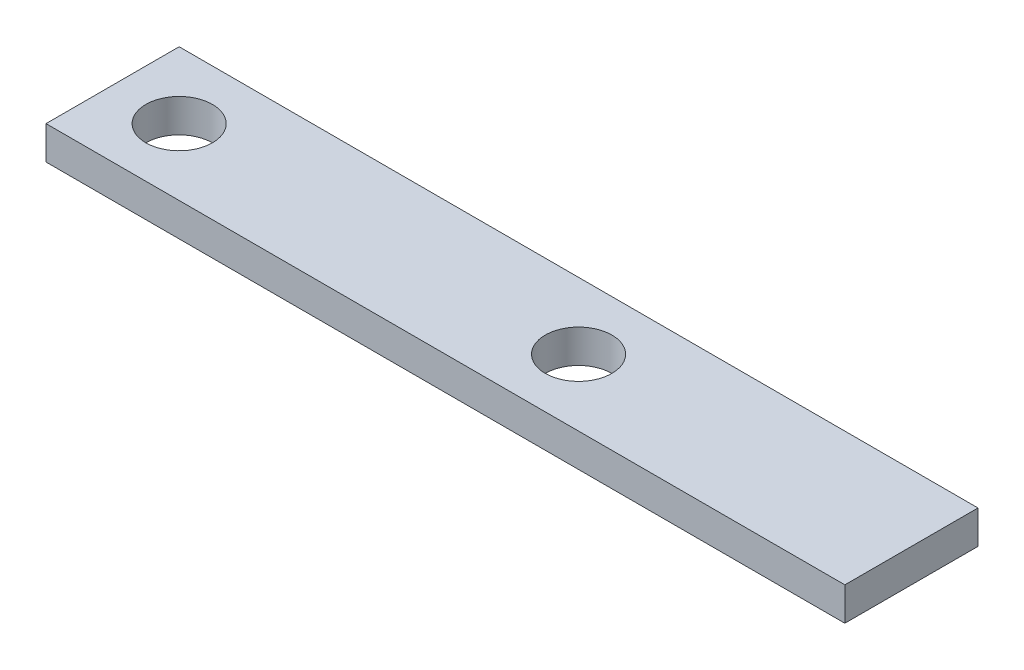
ISO-10303-21;
HEADER;
FILE_DESCRIPTION(('STEP AP214'),'2;1');
FILE_NAME('part.step','',(''),(''),'','','');
FILE_SCHEMA(('AUTOMOTIVE_DESIGN { 1 0 10303 214 1 1 1 1 }'));
ENDSEC;
DATA;
#1=APPLICATION_CONTEXT('core data for automotive mechanical design processes');
#2=APPLICATION_PROTOCOL_DEFINITION('international standard','automotive_design',2000,#1);
#3=PRODUCT_CONTEXT('',#1,'mechanical');
#4=PRODUCT('Part','Part','',(#3));
#5=PRODUCT_RELATED_PRODUCT_CATEGORY('part','',(#4));
#6=PRODUCT_DEFINITION_FORMATION('','',#4);
#7=PRODUCT_DEFINITION_CONTEXT('part definition',#1,'design');
#8=PRODUCT_DEFINITION('design','',#6,#7);
#9=PRODUCT_DEFINITION_SHAPE('','',#8);
#10=(LENGTH_UNIT() NAMED_UNIT(*) SI_UNIT(.MILLI.,.METRE.));
#11=(NAMED_UNIT(*) PLANE_ANGLE_UNIT() SI_UNIT($,.RADIAN.));
#12=(NAMED_UNIT(*) SI_UNIT($,.STERADIAN.) SOLID_ANGLE_UNIT());
#13=UNCERTAINTY_MEASURE_WITH_UNIT(LENGTH_MEASURE(1.E-05),#10,'distance_accuracy_value','');
#14=(GEOMETRIC_REPRESENTATION_CONTEXT(3) GLOBAL_UNCERTAINTY_ASSIGNED_CONTEXT((#13)) GLOBAL_UNIT_ASSIGNED_CONTEXT((#10,
#11,#12)) REPRESENTATION_CONTEXT('',''));
#15=CARTESIAN_POINT('',(0.,0.,0.));
#16=DIRECTION('',(0.,0.,1.));
#17=DIRECTION('',(1.,0.,0.));
#18=AXIS2_PLACEMENT_3D('',#15,#16,#17);
#19=CARTESIAN_POINT('',(0.,3.175,0.));
#20=DIRECTION('',(0.,-1.,0.));
#21=DIRECTION('',(0.,0.,-1.));
#22=AXIS2_PLACEMENT_3D('',#19,#20,#21);
#23=PLANE('',#22);
#24=DIRECTION('',(0.,0.,1.));
#25=VECTOR('',#24,1.);
#26=CARTESIAN_POINT('',(0.,3.175,0.));
#27=LINE('',#26,#25);
#28=CARTESIAN_POINT('',(0.,3.175,-12.7));
#29=VERTEX_POINT('',#28);
#30=CARTESIAN_POINT('',(0.,3.175,0.));
#31=VERTEX_POINT('',#30);
#32=EDGE_CURVE('E98',#29,#31,#27,.T.);
#33=ORIENTED_EDGE('',*,*,#32,.T.);
#34=DIRECTION('',(1.,0.,0.));
#35=VECTOR('',#34,1.);
#36=CARTESIAN_POINT('',(0.,3.175,0.));
#37=LINE('',#36,#35);
#38=CARTESIAN_POINT('',(76.2,3.175,0.));
#39=VERTEX_POINT('',#38);
#40=EDGE_CURVE('E93',#31,#39,#37,.T.);
#41=ORIENTED_EDGE('',*,*,#40,.T.);
#42=DIRECTION('',(0.,0.,-1.));
#43=VECTOR('',#42,1.);
#44=CARTESIAN_POINT('',(76.2,3.175,0.));
#45=LINE('',#44,#43);
#46=CARTESIAN_POINT('',(76.2,3.175,-12.7));
#47=VERTEX_POINT('',#46);
#48=EDGE_CURVE('E96',#39,#47,#45,.T.);
#49=ORIENTED_EDGE('',*,*,#48,.T.);
#50=DIRECTION('',(-1.,0.,0.));
#51=VECTOR('',#50,1.);
#52=CARTESIAN_POINT('',(0.,3.175,-12.7));
#53=LINE('',#52,#51);
#54=EDGE_CURVE('E63',#47,#29,#53,.T.);
#55=ORIENTED_EDGE('',*,*,#54,.T.);
#56=EDGE_LOOP('',(#33,#41,#49,#55));
#57=FACE_BOUND('',#56,.T.);
#58=CARTESIAN_POINT('',(6.35,3.175,-6.35));
#59=DIRECTION('',(0.,1.,0.));
#60=DIRECTION('',(0.,0.,1.));
#61=AXIS2_PLACEMENT_3D('',#58,#59,#60);
#62=CIRCLE('',#61,3.175);
#63=CARTESIAN_POINT('',(6.35,3.175,-3.17499999999999));
#64=VERTEX_POINT('',#63);
#65=EDGE_CURVE('E118',#64,#64,#62,.T.);
#66=ORIENTED_EDGE('',*,*,#65,.F.);
#67=EDGE_LOOP('',(#66));
#68=FACE_BOUND('',#67,.T.);
#69=CARTESIAN_POINT('',(44.45,3.175,-6.34999999999999));
#70=DIRECTION('',(0.,1.,0.));
#71=DIRECTION('',(0.,0.,1.));
#72=AXIS2_PLACEMENT_3D('',#69,#70,#71);
#73=CIRCLE('',#72,3.175);
#74=CARTESIAN_POINT('',(44.45,3.175,-3.17499999999999));
#75=VERTEX_POINT('',#74);
#76=EDGE_CURVE('E140',#75,#75,#73,.T.);
#77=ORIENTED_EDGE('',*,*,#76,.F.);
#78=EDGE_LOOP('',(#77));
#79=FACE_BOUND('',#78,.T.);
#80=ADVANCED_FACE('F45',(#57,#68,#79),#23,.F.);
#81=CARTESIAN_POINT('',(0.,0.,0.));
#82=DIRECTION('',(0.,-1.,0.));
#83=DIRECTION('',(0.,0.,-1.));
#84=AXIS2_PLACEMENT_3D('',#81,#82,#83);
#85=PLANE('',#84);
#86=CARTESIAN_POINT('',(6.35,0.,-6.35));
#87=DIRECTION('',(0.,1.,0.));
#88=DIRECTION('',(0.,0.,1.));
#89=AXIS2_PLACEMENT_3D('',#86,#87,#88);
#90=CIRCLE('',#89,3.175);
#91=CARTESIAN_POINT('',(6.35,0.,-3.17499999999999));
#92=VERTEX_POINT('',#91);
#93=EDGE_CURVE('E136',#92,#92,#90,.T.);
#94=ORIENTED_EDGE('',*,*,#93,.T.);
#95=EDGE_LOOP('',(#94));
#96=FACE_BOUND('',#95,.T.);
#97=DIRECTION('',(0.,0.,1.));
#98=VECTOR('',#97,1.);
#99=CARTESIAN_POINT('',(0.,0.,0.));
#100=LINE('',#99,#98);
#101=CARTESIAN_POINT('',(0.,0.,-12.7));
#102=VERTEX_POINT('',#101);
#103=CARTESIAN_POINT('',(0.,0.,0.));
#104=VERTEX_POINT('',#103);
#105=EDGE_CURVE('E114',#102,#104,#100,.T.);
#106=ORIENTED_EDGE('',*,*,#105,.F.);
#107=DIRECTION('',(-1.,0.,0.));
#108=VECTOR('',#107,1.);
#109=CARTESIAN_POINT('',(0.,0.,-12.7));
#110=LINE('',#109,#108);
#111=CARTESIAN_POINT('',(76.2,0.,-12.7));
#112=VERTEX_POINT('',#111);
#113=EDGE_CURVE('E86',#112,#102,#110,.T.);
#114=ORIENTED_EDGE('',*,*,#113,.F.);
#115=DIRECTION('',(0.,0.,-1.));
#116=VECTOR('',#115,1.);
#117=CARTESIAN_POINT('',(76.2,0.,0.));
#118=LINE('',#117,#116);
#119=CARTESIAN_POINT('',(76.2,0.,0.));
#120=VERTEX_POINT('',#119);
#121=EDGE_CURVE('E80',#120,#112,#118,.T.);
#122=ORIENTED_EDGE('',*,*,#121,.F.);
#123=DIRECTION('',(1.,0.,0.));
#124=VECTOR('',#123,1.);
#125=CARTESIAN_POINT('',(0.,0.,0.));
#126=LINE('',#125,#124);
#127=EDGE_CURVE('E103',#104,#120,#126,.T.);
#128=ORIENTED_EDGE('',*,*,#127,.F.);
#129=EDGE_LOOP('',(#106,#114,#122,#128));
#130=FACE_BOUND('',#129,.T.);
#131=CARTESIAN_POINT('',(44.45,0.,-6.34999999999999));
#132=DIRECTION('',(0.,1.,0.));
#133=DIRECTION('',(0.,0.,1.));
#134=AXIS2_PLACEMENT_3D('',#131,#132,#133);
#135=CIRCLE('',#134,3.175);
#136=CARTESIAN_POINT('',(44.45,0.,-3.17499999999999));
#137=VERTEX_POINT('',#136);
#138=EDGE_CURVE('E144',#137,#137,#135,.T.);
#139=ORIENTED_EDGE('',*,*,#138,.T.);
#140=EDGE_LOOP('',(#139));
#141=FACE_BOUND('',#140,.T.);
#142=ADVANCED_FACE('F131',(#96,#130,#141),#85,.T.);
#143=CARTESIAN_POINT('',(0.,3.175,0.));
#144=DIRECTION('',(1.,0.,0.));
#145=DIRECTION('',(0.,0.,-1.));
#146=AXIS2_PLACEMENT_3D('',#143,#144,#145);
#147=PLANE('',#146);
#148=ORIENTED_EDGE('',*,*,#105,.T.);
#149=DIRECTION('',(0.,-1.,0.));
#150=VECTOR('',#149,1.);
#151=CARTESIAN_POINT('',(0.,3.175,0.));
#152=LINE('',#151,#150);
#153=EDGE_CURVE('E11',#31,#104,#152,.T.);
#154=ORIENTED_EDGE('',*,*,#153,.F.);
#155=ORIENTED_EDGE('',*,*,#32,.F.);
#156=DIRECTION('',(0.,-1.,0.));
#157=VECTOR('',#156,1.);
#158=CARTESIAN_POINT('',(0.,3.175,-12.7));
#159=LINE('',#158,#157);
#160=EDGE_CURVE('E110',#29,#102,#159,.T.);
#161=ORIENTED_EDGE('',*,*,#160,.T.);
#162=EDGE_LOOP('',(#148,#154,#155,#161));
#163=FACE_BOUND('',#162,.T.);
#164=ADVANCED_FACE('F47',(#163),#147,.F.);
#165=CARTESIAN_POINT('',(0.,3.175,0.));
#166=DIRECTION('',(0.,0.,-1.));
#167=DIRECTION('',(-1.,0.,0.));
#168=AXIS2_PLACEMENT_3D('',#165,#166,#167);
#169=PLANE('',#168);
#170=ORIENTED_EDGE('',*,*,#127,.T.);
#171=DIRECTION('',(0.,-1.,0.));
#172=VECTOR('',#171,1.);
#173=CARTESIAN_POINT('',(76.2,3.175,0.));
#174=LINE('',#173,#172);
#175=EDGE_CURVE('E55',#39,#120,#174,.T.);
#176=ORIENTED_EDGE('',*,*,#175,.F.);
#177=ORIENTED_EDGE('',*,*,#40,.F.);
#178=ORIENTED_EDGE('',*,*,#153,.T.);
#179=EDGE_LOOP('',(#170,#176,#177,#178));
#180=FACE_BOUND('',#179,.T.);
#181=ADVANCED_FACE('F102',(#180),#169,.F.);
#182=CARTESIAN_POINT('',(76.2,3.175,0.));
#183=DIRECTION('',(-1.,0.,0.));
#184=DIRECTION('',(0.,0.,1.));
#185=AXIS2_PLACEMENT_3D('',#182,#183,#184);
#186=PLANE('',#185);
#187=ORIENTED_EDGE('',*,*,#121,.T.);
#188=DIRECTION('',(0.,-1.,0.));
#189=VECTOR('',#188,1.);
#190=CARTESIAN_POINT('',(76.2,3.175,-12.7));
#191=LINE('',#190,#189);
#192=EDGE_CURVE('E105',#47,#112,#191,.T.);
#193=ORIENTED_EDGE('',*,*,#192,.F.);
#194=ORIENTED_EDGE('',*,*,#48,.F.);
#195=ORIENTED_EDGE('',*,*,#175,.T.);
#196=EDGE_LOOP('',(#187,#193,#194,#195));
#197=FACE_BOUND('',#196,.T.);
#198=ADVANCED_FACE('F106',(#197),#186,.F.);
#199=CARTESIAN_POINT('',(0.,3.175,-12.7));
#200=DIRECTION('',(0.,0.,1.));
#201=DIRECTION('',(1.,0.,0.));
#202=AXIS2_PLACEMENT_3D('',#199,#200,#201);
#203=PLANE('',#202);
#204=ORIENTED_EDGE('',*,*,#113,.T.);
#205=ORIENTED_EDGE('',*,*,#160,.F.);
#206=ORIENTED_EDGE('',*,*,#54,.F.);
#207=ORIENTED_EDGE('',*,*,#192,.T.);
#208=EDGE_LOOP('',(#204,#205,#206,#207));
#209=FACE_BOUND('',#208,.T.);
#210=ADVANCED_FACE('F128',(#209),#203,.F.);
#211=CARTESIAN_POINT('',(6.35,3.175,-6.35));
#212=DIRECTION('',(0.,-1.,0.));
#213=DIRECTION('',(0.,0.,-1.));
#214=AXIS2_PLACEMENT_3D('',#211,#212,#213);
#215=CYLINDRICAL_SURFACE('',#214,3.175);
#216=ORIENTED_EDGE('',*,*,#65,.T.);
#217=EDGE_LOOP('',(#216));
#218=FACE_BOUND('',#217,.T.);
#219=ORIENTED_EDGE('',*,*,#93,.F.);
#220=EDGE_LOOP('',(#219));
#221=FACE_BOUND('',#220,.T.);
#222=ADVANCED_FACE('F163',(#218,#221),#215,.F.);
#223=CARTESIAN_POINT('',(44.45,3.175,-6.34999999999999));
#224=DIRECTION('',(0.,-1.,0.));
#225=DIRECTION('',(0.,0.,-1.));
#226=AXIS2_PLACEMENT_3D('',#223,#224,#225);
#227=CYLINDRICAL_SURFACE('',#226,3.175);
#228=ORIENTED_EDGE('',*,*,#76,.T.);
#229=EDGE_LOOP('',(#228));
#230=FACE_BOUND('',#229,.T.);
#231=ORIENTED_EDGE('',*,*,#138,.F.);
#232=EDGE_LOOP('',(#231));
#233=FACE_BOUND('',#232,.T.);
#234=ADVANCED_FACE('F152',(#230,#233),#227,.F.);
#235=CLOSED_SHELL('',(#80,#142,#164,#181,#198,#210,#222,#234));
#236=MANIFOLD_SOLID_BREP('B2',#235);
#237=ADVANCED_BREP_SHAPE_REPRESENTATION('',(#18,#236),#14);
#238=SHAPE_DEFINITION_REPRESENTATION(#9,#237);
ENDSEC;
END-ISO-10303-21;
